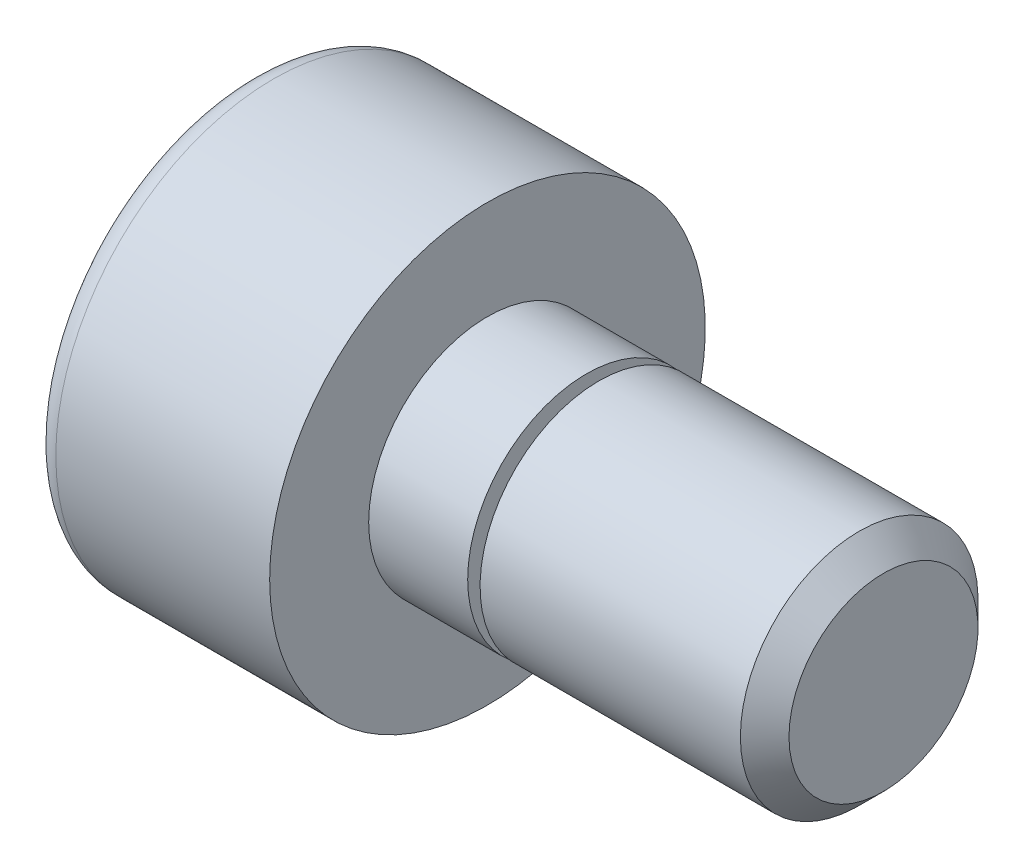
ISO-10303-21;
HEADER;
FILE_DESCRIPTION(('STEP AP214'),'2;1');
FILE_NAME('part.step','',(''),(''),'','','');
FILE_SCHEMA(('AUTOMOTIVE_DESIGN { 1 0 10303 214 1 1 1 1 }'));
ENDSEC;
DATA;
#1=APPLICATION_CONTEXT('core data for automotive mechanical design processes');
#2=APPLICATION_PROTOCOL_DEFINITION('international standard','automotive_design',2000,#1);
#3=PRODUCT_CONTEXT('',#1,'mechanical');
#4=PRODUCT('Part','Part','',(#3));
#5=PRODUCT_RELATED_PRODUCT_CATEGORY('part','',(#4));
#6=PRODUCT_DEFINITION_FORMATION('','',#4);
#7=PRODUCT_DEFINITION_CONTEXT('part definition',#1,'design');
#8=PRODUCT_DEFINITION('design','',#6,#7);
#9=PRODUCT_DEFINITION_SHAPE('','',#8);
#10=(LENGTH_UNIT() NAMED_UNIT(*) SI_UNIT(.MILLI.,.METRE.));
#11=(NAMED_UNIT(*) PLANE_ANGLE_UNIT() SI_UNIT($,.RADIAN.));
#12=(NAMED_UNIT(*) SI_UNIT($,.STERADIAN.) SOLID_ANGLE_UNIT());
#13=UNCERTAINTY_MEASURE_WITH_UNIT(LENGTH_MEASURE(1.E-05),#10,'distance_accuracy_value','');
#14=(GEOMETRIC_REPRESENTATION_CONTEXT(3) GLOBAL_UNCERTAINTY_ASSIGNED_CONTEXT((#13)) GLOBAL_UNIT_ASSIGNED_CONTEXT((#10,
#11,#12)) REPRESENTATION_CONTEXT('',''));
#15=CARTESIAN_POINT('',(0.,0.,0.));
#16=DIRECTION('',(0.,0.,1.));
#17=DIRECTION('',(1.,0.,0.));
#18=AXIS2_PLACEMENT_3D('',#15,#16,#17);
#19=CARTESIAN_POINT('',(4.99999999999999,0.596637499999982,0.));
#20=DIRECTION('',(1.,0.,0.));
#21=DIRECTION('',(0.,0.,-1.));
#22=AXIS2_PLACEMENT_3D('',#19,#20,#21);
#23=PLANE('',#22);
#24=CARTESIAN_POINT('',(5.00000000016598,0.,0.));
#25=DIRECTION('',(-1.,0.,0.));
#26=DIRECTION('',(0.,0.,1.));
#27=AXIS2_PLACEMENT_3D('',#24,#25,#26);
#28=CIRCLE('',#27,1.19327500010516);
#29=CARTESIAN_POINT('',(5.00000000016598,0.,1.19327500010516));
#30=VERTEX_POINT('',#29);
#31=EDGE_CURVE('E21',#30,#30,#28,.T.);
#32=ORIENTED_EDGE('',*,*,#31,.F.);
#33=EDGE_LOOP('',(#32));
#34=FACE_BOUND('',#33,.T.);
#35=ADVANCED_FACE('F17',(#34),#23,.T.);
#36=CARTESIAN_POINT('',(-1.70500129758011,0.,0.));
#37=DIRECTION('',(-1.,0.,0.));
#38=DIRECTION('',(0.,0.,1.));
#39=AXIS2_PLACEMENT_3D('',#36,#37,#38);
#40=CONICAL_SURFACE('',#39,1.45241249947506,1.04719754996206);
#41=CARTESIAN_POINT('',(-1.70000000094277,1.25000000021478,0.72243619933285));
#42=CARTESIAN_POINT('',(-1.68286546728477,1.25000000007714,0.663132482672235));
#43=CARTESIAN_POINT('',(-1.66717718499298,1.25000000002068,0.60335915904882));
#44=CARTESIAN_POINT('',(-1.63944863544149,1.24999999997928,0.48283994569199));
#45=CARTESIAN_POINT('',(-1.62741655949806,1.24999999999451,0.422092188519454));
#46=CARTESIAN_POINT('',(-1.60806725664683,1.25000000000537,0.301279508814381));
#47=CARTESIAN_POINT('',(-1.60064670562814,1.25000000000144,0.241231655699456));
#48=CARTESIAN_POINT('',(-1.59068492800529,1.24999999999857,0.120788901606474));
#49=CARTESIAN_POINT('',(-1.58813838618776,1.24999999999962,0.0603944508005647));
#50=CARTESIAN_POINT('',(-1.5881383861876,1.25000000000039,-0.0603944508133266));
#51=CARTESIAN_POINT('',(-1.59068492800512,1.25000000000011,-0.120788901621308));
#52=CARTESIAN_POINT('',(-1.60064670563102,1.2499999999999,-0.241231655717374));
#53=CARTESIAN_POINT('',(-1.60806725665276,1.24999999999997,-0.301279508833313));
#54=CARTESIAN_POINT('',(-1.62741655949895,1.25000000000003,-0.422092188543554));
#55=CARTESIAN_POINT('',(-1.63944863543404,1.25000000000002,-0.482839945720312));
#56=CARTESIAN_POINT('',(-1.66717718501289,1.24999999999999,-0.603359159074811));
#57=CARTESIAN_POINT('',(-1.68286546734031,1.24999999999997,-0.663132482691691));
#58=CARTESIAN_POINT('',(-1.70000000108341,1.25,-0.722436199332856));
#59=B_SPLINE_CURVE_WITH_KNOTS('',3,(#41,#42,#43,#44,#45,#46,#47,#48,#49,#50,#51,#52,#53,#54,#55,
#56,#57,#58),.UNSPECIFIED.,.F.,.F.,(4,2,2,2,2,2,2,2,4),(0.,0.185245445220431,0.370902902910376,
0.552234531911014,0.733368301892384,0.914502071879368,1.09583370088516,1.28149115858095,
1.46673660380932),.UNSPECIFIED.);
#60=CARTESIAN_POINT('',(-1.70000000111742,1.24999999986595,0.722436199682553));
#61=VERTEX_POINT('',#60);
#62=CARTESIAN_POINT('',(-1.70000000107267,1.24999999986595,-0.722436199527635));
#63=VERTEX_POINT('',#62);
#64=EDGE_CURVE('E89',#61,#63,#59,.T.);
#65=ORIENTED_EDGE('',*,*,#64,.T.);
#66=CARTESIAN_POINT('',(-1.700000000943,1.24999999987166,-0.722436199927195));
#67=CARTESIAN_POINT('',(-1.6816864655273,1.19504705421582,-0.754146854227431));
#68=CARTESIAN_POINT('',(-1.66503261857527,1.13961974362593,-0.78613124140006));
#69=CARTESIAN_POINT('',(-1.63596693871197,1.02780588171514,-0.850653546689622));
#70=CARTESIAN_POINT('',(-1.62356538163229,0.971417347626694,-0.883192608964836));
#71=CARTESIAN_POINT('',(-1.60426571868782,0.859338910256709,-0.947867587858669));
#72=CARTESIAN_POINT('',(-1.59723907577038,0.803666224581152,-0.979993569040396));
#73=CARTESIAN_POINT('',(-1.58885965389637,0.692059674420903,-1.04439624491314));
#74=CARTESIAN_POINT('',(-1.5874999265965,0.636126214014896,-1.07667270643012));
#75=CARTESIAN_POINT('',(-1.59036989313561,0.531663263643826,-1.13695316061698));
#76=CARTESIAN_POINT('',(-1.59389492551738,0.483117920552456,-1.16496630135008));
#77=CARTESIAN_POINT('',(-1.6050543982455,0.386343418562456,-1.22081012839927));
#78=CARTESIAN_POINT('',(-1.61269262928899,0.338114592929905,-1.24864062240381));
#79=CARTESIAN_POINT('',(-1.63178257578252,0.241141503285944,-1.30459904466556));
#80=CARTESIAN_POINT('',(-1.64331499479382,0.192409476238432,-1.33271991157001));
#81=CARTESIAN_POINT('',(-1.66948711578779,0.0956711177374292,-1.38854288198143));
#82=CARTESIAN_POINT('',(-1.68412069146549,0.0476635525329205,-1.41624569742571));
#83=CARTESIAN_POINT('',(-1.70000000108261,2.38524423776675E-10,-1.44374999986237));
#84=B_SPLINE_CURVE_WITH_KNOTS('',3,(#66,#67,#68,#69,#70,#71,#72,#73,#74,#75,#76,#77,#78,#79,#80,
#81,#82,#83),.UNSPECIFIED.,.F.,.F.,(4,2,2,2,2,2,2,2,4),(0.,0.198186454369542,0.396848513662745,
0.590596800568341,0.784107457962589,0.952424174462504,1.12089627669237,1.29309918128375,
1.46496502007198),.UNSPECIFIED.);
#85=CARTESIAN_POINT('',(-1.70000000107275,0.,-1.44374999984529));
#86=VERTEX_POINT('',#85);
#87=EDGE_CURVE('E117',#63,#86,#84,.T.);
#88=ORIENTED_EDGE('',*,*,#87,.T.);
#89=CARTESIAN_POINT('',(-1.70000000094296,-3.43022918294522E-10,-1.44375000005));
#90=CARTESIAN_POINT('',(-1.68168646552727,-0.0549529458612903,-1.41203934551137));
#91=CARTESIAN_POINT('',(-1.66503261857524,-0.11038025639475,-1.38005495824094));
#92=CARTESIAN_POINT('',(-1.63596693871195,-0.222194118264154,-1.31553265287968));
#93=CARTESIAN_POINT('',(-1.62356538163226,-0.278582652367828,-1.28299359063086));
#94=CARTESIAN_POINT('',(-1.6042657186878,-0.390661089748638,-1.2183186117558));
#95=CARTESIAN_POINT('',(-1.59723907577036,-0.446333775420271,-1.18619263056727));
#96=CARTESIAN_POINT('',(-1.58885965389634,-0.557940325577665,-1.1217899546896));
#97=CARTESIAN_POINT('',(-1.58749992659647,-0.613873785984737,-1.08951349317446));
#98=CARTESIAN_POINT('',(-1.59036989313559,-0.718336736356475,-1.02923303898876));
#99=CARTESIAN_POINT('',(-1.59389492551736,-0.766882079447621,-1.00121989825526));
#100=CARTESIAN_POINT('',(-1.60505439824547,-0.86365658143746,-0.945376071205784));
#101=CARTESIAN_POINT('',(-1.61269262928897,-0.911885407070074,-0.917545577201342));
#102=CARTESIAN_POINT('',(-1.6317825757825,-1.00885849671409,-0.861587154939678));
#103=CARTESIAN_POINT('',(-1.6433149947938,-1.05759052376159,-0.833466288035202));
#104=CARTESIAN_POINT('',(-1.66948711578777,-1.15432888226258,-0.777643317623734));
#105=CARTESIAN_POINT('',(-1.68412069146548,-1.20233644746708,-0.749940502179433));
#106=CARTESIAN_POINT('',(-1.7000000010826,-1.2499999997615,-0.722436199742815));
#107=B_SPLINE_CURVE_WITH_KNOTS('',3,(#89,#90,#91,#92,#93,#94,#95,#96,#97,#98,#99,#100,#101,#102,
#103,#104,#105,#106),.UNSPECIFIED.,.F.,.F.,(4,2,2,2,2,2,2,2,4),(0.,0.198186454369533,
0.396848513662727,0.590596800568313,0.784107457962553,0.952424174462478,1.12089627669236,
1.29309918128375,1.46496502007199),.UNSPECIFIED.);
#108=CARTESIAN_POINT('',(-1.70000000107264,-1.24999999986598,-0.722436199527589));
#109=VERTEX_POINT('',#108);
#110=EDGE_CURVE('E147',#86,#109,#107,.T.);
#111=ORIENTED_EDGE('',*,*,#110,.T.);
#112=CARTESIAN_POINT('',(-1.70000000094272,-1.2500000002148,-0.722436199332815));
#113=CARTESIAN_POINT('',(-1.68286546728472,-1.25000000007715,-0.663132482672202));
#114=CARTESIAN_POINT('',(-1.66717718499294,-1.25000000002068,-0.603359159048789));
#115=CARTESIAN_POINT('',(-1.63944863544145,-1.24999999997928,-0.482839945691965));
#116=CARTESIAN_POINT('',(-1.62741655949802,-1.24999999999451,-0.422092188519433));
#117=CARTESIAN_POINT('',(-1.6080672566468,-1.25000000000537,-0.301279508814366));
#118=CARTESIAN_POINT('',(-1.6006467056281,-1.25000000000144,-0.241231655699444));
#119=CARTESIAN_POINT('',(-1.59068492800526,-1.24999999999857,-0.120788901606469));
#120=CARTESIAN_POINT('',(-1.58813838618773,-1.24999999999962,-0.0603944508005625));
#121=CARTESIAN_POINT('',(-1.58813838618756,-1.25000000000039,0.0603944508133228));
#122=CARTESIAN_POINT('',(-1.59068492800508,-1.25000000000011,0.120788901621301));
#123=CARTESIAN_POINT('',(-1.60064670563099,-1.2499999999999,0.241231655717361));
#124=CARTESIAN_POINT('',(-1.60806725665273,-1.24999999999997,0.301279508833298));
#125=CARTESIAN_POINT('',(-1.62741655949892,-1.25000000000003,0.422092188543532));
#126=CARTESIAN_POINT('',(-1.63944863543401,-1.25000000000002,0.482839945720288));
#127=CARTESIAN_POINT('',(-1.66717718501285,-1.24999999999999,0.603359159074781));
#128=CARTESIAN_POINT('',(-1.68286546734028,-1.24999999999997,0.663132482691658));
#129=CARTESIAN_POINT('',(-1.70000000108337,-1.25,0.72243619933282));
#130=B_SPLINE_CURVE_WITH_KNOTS('',3,(#112,#113,#114,#115,#116,#117,#118,#119,#120,#121,#122,
#123,#124,#125,#126,#127,#128,#129),.UNSPECIFIED.,.F.,.F.,(4,2,2,2,2,2,2,2,4),(0.,
0.18524544522042,0.370902902910356,0.552234531910984,0.733368301892344,0.914502071879319,
1.0958337008851,1.28149115858089,1.46673660380924),.UNSPECIFIED.);
#131=CARTESIAN_POINT('',(-1.70000000107264,-1.24999999986597,0.722436199527603));
#132=VERTEX_POINT('',#131);
#133=EDGE_CURVE('E142',#109,#132,#130,.T.);
#134=ORIENTED_EDGE('',*,*,#133,.T.);
#135=CARTESIAN_POINT('',(-1.70000000094299,-1.24999999987169,0.722436199927152));
#136=CARTESIAN_POINT('',(-1.68168646552729,-1.19504705421587,0.754146854227398));
#137=CARTESIAN_POINT('',(-1.66503261857526,-1.13961974362597,0.786131241400031));
#138=CARTESIAN_POINT('',(-1.63596693871196,-1.02780588171519,0.850653546689596));
#139=CARTESIAN_POINT('',(-1.62356538163227,-0.971417347626742,0.883192608964809));
#140=CARTESIAN_POINT('',(-1.60426571868781,-0.859338910256757,0.947867587858641));
#141=CARTESIAN_POINT('',(-1.59723907577037,-0.803666224581201,0.979993569040368));
#142=CARTESIAN_POINT('',(-1.58885965389635,-0.692059674420952,1.04439624491311));
#143=CARTESIAN_POINT('',(-1.58749992659648,-0.636126214014945,1.07667270643009));
#144=CARTESIAN_POINT('',(-1.5903698931356,-0.531663263643873,1.13695316061695));
#145=CARTESIAN_POINT('',(-1.59389492551737,-0.483117920552502,1.16496630135006));
#146=CARTESIAN_POINT('',(-1.60505439824548,-0.386343418562498,1.22081012839924));
#147=CARTESIAN_POINT('',(-1.61269262928897,-0.338114592929946,1.24864062240379));
#148=CARTESIAN_POINT('',(-1.63178257578251,-0.241141503285981,1.30459904466554));
#149=CARTESIAN_POINT('',(-1.64331499479381,-0.192409476238467,1.33271991156999));
#150=CARTESIAN_POINT('',(-1.66948711578778,-0.0956711177374604,1.38854288198141));
#151=CARTESIAN_POINT('',(-1.68412069146548,-0.0476635525329499,1.41624569742569));
#152=CARTESIAN_POINT('',(-1.7000000010826,-2.38552283071818E-10,1.44374999986235));
#153=B_SPLINE_CURVE_WITH_KNOTS('',3,(#135,#136,#137,#138,#139,#140,#141,#142,#143,#144,#145,
#146,#147,#148,#149,#150,#151,#152),.UNSPECIFIED.,.F.,.F.,(4,2,2,2,2,2,2,2,4),(0.,
0.198186454369543,0.396848513662746,0.590596800568341,0.784107457962588,0.952424174462509,
1.12089627669239,1.29309918128377,1.46496502007201),.UNSPECIFIED.);
#154=CARTESIAN_POINT('',(-1.70000000107275,0.,1.44374999984529));
#155=VERTEX_POINT('',#154);
#156=EDGE_CURVE('E92',#132,#155,#153,.T.);
#157=ORIENTED_EDGE('',*,*,#156,.T.);
#158=CARTESIAN_POINT('',(-1.70000000094297,3.4299262673622E-10,1.44375000005));
#159=CARTESIAN_POINT('',(-1.68168646552728,0.054952945861264,1.41203934551138));
#160=CARTESIAN_POINT('',(-1.66503261857525,0.110380256394726,1.38005495824095));
#161=CARTESIAN_POINT('',(-1.63596693871196,0.222194118264133,1.31553265287969));
#162=CARTESIAN_POINT('',(-1.62356538163227,0.278582652367809,1.28299359063087));
#163=CARTESIAN_POINT('',(-1.60426571868781,0.390661089748621,1.21831861175581));
#164=CARTESIAN_POINT('',(-1.59723907577037,0.446333775420254,1.18619263056728));
#165=CARTESIAN_POINT('',(-1.58885965389636,0.557940325577651,1.1217899546896));
#166=CARTESIAN_POINT('',(-1.58749992659649,0.613873785984724,1.08951349317447));
#167=CARTESIAN_POINT('',(-1.5903698931356,0.718336736356459,1.02923303898877));
#168=CARTESIAN_POINT('',(-1.59389492551737,0.766882079447602,1.00121989825527));
#169=CARTESIAN_POINT('',(-1.60505439824549,0.863656581437433,0.9453760712058));
#170=CARTESIAN_POINT('',(-1.61269262928898,0.911885407070043,0.91754557720136));
#171=CARTESIAN_POINT('',(-1.63178257578252,1.00885849671405,0.8615871549397));
#172=CARTESIAN_POINT('',(-1.64331499479382,1.05759052376155,0.833466288035226));
#173=CARTESIAN_POINT('',(-1.66948711578779,1.15432888226253,0.777643317623762));
#174=CARTESIAN_POINT('',(-1.68412069146549,1.20233644746702,0.749940502179464));
#175=CARTESIAN_POINT('',(-1.70000000108261,1.24999999976144,0.722436199742848));
#176=B_SPLINE_CURVE_WITH_KNOTS('',3,(#158,#159,#160,#161,#162,#163,#164,#165,#166,#167,#168,
#169,#170,#171,#172,#173,#174,#175),.UNSPECIFIED.,.F.,.F.,(4,2,2,2,2,2,2,2,4),(0.,
0.198186454369537,0.396848513662734,0.590596800568325,0.784107457962568,0.952424174462481,
1.12089627669235,1.29309918128372,1.46496502007196),.UNSPECIFIED.);
#177=EDGE_CURVE('E62',#155,#61,#176,.T.);
#178=ORIENTED_EDGE('',*,*,#177,.T.);
#179=EDGE_LOOP('',(#65,#88,#111,#134,#157,#178));
#180=FACE_BOUND('',#179,.T.);
#181=CARTESIAN_POINT('',(-0.866450547675868,0.,0.));
#182=VERTEX_POINT('',#181);
#183=VERTEX_LOOP('',#182);
#184=FACE_BOUND('',#183,.T.);
#185=ADVANCED_FACE('F86',(#180,#184),#40,.F.);
#186=CARTESIAN_POINT('',(4.69327499990868,0.,0.));
#187=DIRECTION('',(-1.,0.,0.));
#188=DIRECTION('',(0.,0.,1.));
#189=AXIS2_PLACEMENT_3D('',#186,#187,#188);
#190=CONICAL_SURFACE('',#189,1.49999999979403,0.78539816247083);
#191=CARTESIAN_POINT('',(4.69327500000009,0.,0.));
#192=DIRECTION('',(-1.,0.,0.));
#193=DIRECTION('',(0.,1.,0.));
#194=AXIS2_PLACEMENT_3D('',#191,#192,#193);
#195=CIRCLE('',#194,1.49999999999999);
#196=CARTESIAN_POINT('',(4.69327500000009,1.49999999999997,0.));
#197=VERTEX_POINT('',#196);
#198=EDGE_CURVE('E104',#197,#197,#195,.T.);
#199=ORIENTED_EDGE('',*,*,#198,.F.);
#200=EDGE_LOOP('',(#199));
#201=FACE_BOUND('',#200,.T.);
#202=ORIENTED_EDGE('',*,*,#31,.T.);
#203=EDGE_LOOP('',(#202));
#204=FACE_BOUND('',#203,.T.);
#205=ADVANCED_FACE('F129',(#201,#204),#190,.T.);
#206=CARTESIAN_POINT('',(-2.99999999999999,0.,1.44374999999999));
#207=DIRECTION('',(0.,0.499805607369878,0.86613760733594));
#208=DIRECTION('',(0.,-0.86613760733594,0.499805607369878));
#209=AXIS2_PLACEMENT_3D('',#206,#207,#208);
#210=PLANE('',#209);
#211=DIRECTION('',(1.,0.,0.));
#212=VECTOR('',#211,1.);
#213=CARTESIAN_POINT('',(-2.99999999999999,0.,1.44375000000002));
#214=LINE('',#213,#212);
#215=CARTESIAN_POINT('',(-2.99999999999999,0.,1.44375));
#216=VERTEX_POINT('',#215);
#217=EDGE_CURVE('E94',#155,#216,#214,.F.);
#218=ORIENTED_EDGE('',*,*,#217,.T.);
#219=DIRECTION('',(0.,-0.866137607335945,0.499805607369869));
#220=VECTOR('',#219,1.);
#221=CARTESIAN_POINT('',(-2.99999999999999,1.25,0.722436199605204));
#222=LINE('',#221,#220);
#223=CARTESIAN_POINT('',(-2.99999999999999,1.25,0.722436199605204));
#224=VERTEX_POINT('',#223);
#225=EDGE_CURVE('E83',#224,#216,#222,.T.);
#226=ORIENTED_EDGE('',*,*,#225,.F.);
#227=DIRECTION('',(1.,0.,0.));
#228=VECTOR('',#227,1.);
#229=CARTESIAN_POINT('',(-2.99999999999999,1.25,0.722436199605204));
#230=LINE('',#229,#228);
#231=EDGE_CURVE('E95',#224,#61,#230,.T.);
#232=ORIENTED_EDGE('',*,*,#231,.T.);
#233=ORIENTED_EDGE('',*,*,#177,.F.);
#234=EDGE_LOOP('',(#218,#226,#232,#233));
#235=FACE_BOUND('',#234,.T.);
#236=ADVANCED_FACE('F96',(#235),#210,.F.);
#237=CARTESIAN_POINT('',(-2.99999999999999,-1.25,0.722436199605204));
#238=DIRECTION('',(0.,-0.499805607369878,0.86613760733594));
#239=DIRECTION('',(0.,-0.86613760733594,-0.499805607369878));
#240=AXIS2_PLACEMENT_3D('',#237,#238,#239);
#241=PLANE('',#240);
#242=DIRECTION('',(1.,0.,0.));
#243=VECTOR('',#242,1.);
#244=CARTESIAN_POINT('',(-2.99999999999999,-1.25,0.722436199605153));
#245=LINE('',#244,#243);
#246=CARTESIAN_POINT('',(-2.99999999999999,-1.25,0.722436199605172));
#247=VERTEX_POINT('',#246);
#248=EDGE_CURVE('E265',#132,#247,#245,.F.);
#249=ORIENTED_EDGE('',*,*,#248,.T.);
#250=DIRECTION('',(0.,-0.866137607335945,-0.499805607369869));
#251=VECTOR('',#250,1.);
#252=CARTESIAN_POINT('',(-2.99999999999999,0.,1.44374999999999));
#253=LINE('',#252,#251);
#254=EDGE_CURVE('E228',#216,#247,#253,.T.);
#255=ORIENTED_EDGE('',*,*,#254,.F.);
#256=ORIENTED_EDGE('',*,*,#217,.F.);
#257=ORIENTED_EDGE('',*,*,#156,.F.);
#258=EDGE_LOOP('',(#249,#255,#256,#257));
#259=FACE_BOUND('',#258,.T.);
#260=ADVANCED_FACE('F263',(#259),#241,.F.);
#261=CARTESIAN_POINT('',(-2.99999999999999,-1.25,-0.722436199605204));
#262=DIRECTION('',(0.,-1.,0.));
#263=DIRECTION('',(0.,0.,-1.));
#264=AXIS2_PLACEMENT_3D('',#261,#262,#263);
#265=PLANE('',#264);
#266=DIRECTION('',(1.,0.,0.));
#267=VECTOR('',#266,1.);
#268=CARTESIAN_POINT('',(-2.99999999999999,-1.25000000000008,-0.722436199605145));
#269=LINE('',#268,#267);
#270=CARTESIAN_POINT('',(-2.99999999999999,-1.25000000000005,-0.722436199605169));
#271=VERTEX_POINT('',#270);
#272=EDGE_CURVE('E154',#109,#271,#269,.F.);
#273=ORIENTED_EDGE('',*,*,#272,.T.);
#274=DIRECTION('',(0.,0.,1.));
#275=VECTOR('',#274,1.);
#276=CARTESIAN_POINT('',(-2.99999999999999,-1.25,0.));
#277=LINE('',#276,#275);
#278=EDGE_CURVE('E242',#247,#271,#277,.F.);
#279=ORIENTED_EDGE('',*,*,#278,.F.);
#280=ORIENTED_EDGE('',*,*,#248,.F.);
#281=ORIENTED_EDGE('',*,*,#133,.F.);
#282=EDGE_LOOP('',(#273,#279,#280,#281));
#283=FACE_BOUND('',#282,.T.);
#284=ADVANCED_FACE('F159',(#283),#265,.F.);
#285=CARTESIAN_POINT('',(-2.99999999999999,0.,-1.44374999999999));
#286=DIRECTION('',(0.,-0.499805607369878,-0.86613760733594));
#287=DIRECTION('',(0.,0.86613760733594,-0.499805607369878));
#288=AXIS2_PLACEMENT_3D('',#285,#286,#287);
#289=PLANE('',#288);
#290=DIRECTION('',(1.,0.,0.));
#291=VECTOR('',#290,1.);
#292=CARTESIAN_POINT('',(-2.99999999999999,0.,-1.44375000000003));
#293=LINE('',#292,#291);
#294=CARTESIAN_POINT('',(-2.99999999999999,0.,-1.44375000000002));
#295=VERTEX_POINT('',#294);
#296=EDGE_CURVE('E153',#86,#295,#293,.F.);
#297=ORIENTED_EDGE('',*,*,#296,.T.);
#298=DIRECTION('',(0.,0.866137607335945,-0.499805607369869));
#299=VECTOR('',#298,1.);
#300=CARTESIAN_POINT('',(-2.99999999999999,-1.25,-0.722436199605204));
#301=LINE('',#300,#299);
#302=EDGE_CURVE('E237',#271,#295,#301,.T.);
#303=ORIENTED_EDGE('',*,*,#302,.F.);
#304=ORIENTED_EDGE('',*,*,#272,.F.);
#305=ORIENTED_EDGE('',*,*,#110,.F.);
#306=EDGE_LOOP('',(#297,#303,#304,#305));
#307=FACE_BOUND('',#306,.T.);
#308=ADVANCED_FACE('F155',(#307),#289,.F.);
#309=CARTESIAN_POINT('',(-2.99999999999999,1.25,-0.722436199605204));
#310=DIRECTION('',(0.,0.499805607369878,-0.86613760733594));
#311=DIRECTION('',(0.,0.86613760733594,0.499805607369878));
#312=AXIS2_PLACEMENT_3D('',#309,#310,#311);
#313=PLANE('',#312);
#314=DIRECTION('',(1.,0.,0.));
#315=VECTOR('',#314,1.);
#316=CARTESIAN_POINT('',(-2.99999999999999,1.25,-0.722436199605204));
#317=LINE('',#316,#315);
#318=CARTESIAN_POINT('',(-2.99999999999999,1.25,-0.722436199605204));
#319=VERTEX_POINT('',#318);
#320=EDGE_CURVE('E100',#63,#319,#317,.F.);
#321=ORIENTED_EDGE('',*,*,#320,.T.);
#322=DIRECTION('',(0.,0.866137607335945,0.499805607369869));
#323=VECTOR('',#322,1.);
#324=CARTESIAN_POINT('',(-2.99999999999999,0.,-1.44374999999999));
#325=LINE('',#324,#323);
#326=EDGE_CURVE('E232',#295,#319,#325,.T.);
#327=ORIENTED_EDGE('',*,*,#326,.F.);
#328=ORIENTED_EDGE('',*,*,#296,.F.);
#329=ORIENTED_EDGE('',*,*,#87,.F.);
#330=EDGE_LOOP('',(#321,#327,#328,#329));
#331=FACE_BOUND('',#330,.T.);
#332=ADVANCED_FACE('F158',(#331),#313,.F.);
#333=CARTESIAN_POINT('',(-2.99999999999999,1.25,0.722436199605204));
#334=DIRECTION('',(0.,1.,0.));
#335=DIRECTION('',(0.,0.,1.));
#336=AXIS2_PLACEMENT_3D('',#333,#334,#335);
#337=PLANE('',#336);
#338=ORIENTED_EDGE('',*,*,#231,.F.);
#339=DIRECTION('',(0.,0.,1.));
#340=VECTOR('',#339,1.);
#341=CARTESIAN_POINT('',(-2.99999999999999,1.25,0.));
#342=LINE('',#341,#340);
#343=EDGE_CURVE('E225',#319,#224,#342,.T.);
#344=ORIENTED_EDGE('',*,*,#343,.F.);
#345=ORIENTED_EDGE('',*,*,#320,.F.);
#346=ORIENTED_EDGE('',*,*,#64,.F.);
#347=EDGE_LOOP('',(#338,#344,#345,#346));
#348=FACE_BOUND('',#347,.T.);
#349=ADVANCED_FACE('F103',(#348),#337,.F.);
#350=CARTESIAN_POINT('',(4.69327500000009,0.,0.));
#351=DIRECTION('',(-1.,0.,0.));
#352=DIRECTION('',(0.,0.,1.));
#353=AXIS2_PLACEMENT_3D('',#350,#351,#352);
#354=CYLINDRICAL_SURFACE('',#353,1.49999999999999);
#355=CARTESIAN_POINT('',(1.40630773523753,0.,0.));
#356=DIRECTION('',(1.,0.,0.));
#357=DIRECTION('',(0.,1.,0.));
#358=AXIS2_PLACEMENT_3D('',#355,#356,#357);
#359=CIRCLE('',#358,1.49999999990769);
#360=CARTESIAN_POINT('',(1.40630773523753,1.49999999990769,0.));
#361=VERTEX_POINT('',#360);
#362=EDGE_CURVE('E214',#361,#361,#359,.F.);
#363=ORIENTED_EDGE('',*,*,#362,.F.);
#364=EDGE_LOOP('',(#363));
#365=FACE_BOUND('',#364,.T.);
#366=ORIENTED_EDGE('',*,*,#198,.T.);
#367=EDGE_LOOP('',(#366));
#368=FACE_BOUND('',#367,.T.);
#369=ADVANCED_FACE('F169',(#365,#368),#354,.T.);
#370=CARTESIAN_POINT('',(-2.99999999999999,2.09687499999998,0.));
#371=DIRECTION('',(-1.,0.,0.));
#372=DIRECTION('',(0.,0.,1.));
#373=AXIS2_PLACEMENT_3D('',#370,#371,#372);
#374=PLANE('',#373);
#375=ORIENTED_EDGE('',*,*,#326,.T.);
#376=ORIENTED_EDGE('',*,*,#343,.T.);
#377=ORIENTED_EDGE('',*,*,#225,.T.);
#378=ORIENTED_EDGE('',*,*,#254,.T.);
#379=ORIENTED_EDGE('',*,*,#278,.T.);
#380=ORIENTED_EDGE('',*,*,#302,.T.);
#381=EDGE_LOOP('',(#375,#376,#377,#378,#379,#380));
#382=FACE_BOUND('',#381,.T.);
#383=CARTESIAN_POINT('',(-2.99999999999999,0.,-2.44999999999998));
#384=CARTESIAN_POINT('',(-2.99999999999999,-0.467309748428942,-2.44989883647268));
#385=CARTESIAN_POINT('',(-2.99999999999999,-0.90183203842658,-2.27798133760294));
#386=CARTESIAN_POINT('',(-2.99999999999999,-1.37316590275585,-2.09149944483619));
#387=CARTESIAN_POINT('',(-2.99999999999999,-1.73241161390703,-1.73241161390703));
#388=CARTESIAN_POINT('',(-2.99999999999999,-2.09091197099622,-1.37406880947389));
#389=CARTESIAN_POINT('',(-2.99999999999999,-2.27798133760293,-0.901832038426582));
#390=CARTESIAN_POINT('',(-2.99999999999999,-2.44989872063515,-0.467844842539404));
#391=CARTESIAN_POINT('',(-2.99999999999999,-2.44999999999998,0.));
#392=CARTESIAN_POINT('',(-2.99999999999999,-2.45010105288337,0.466798645496681));
#393=CARTESIAN_POINT('',(-2.99999999999999,-2.27798133760294,0.901832038426581));
#394=CARTESIAN_POINT('',(-2.99999999999999,-2.09149944483591,1.37316590275613));
#395=CARTESIAN_POINT('',(-2.99999999999999,-1.73241161390703,1.73241161390703));
#396=CARTESIAN_POINT('',(-2.99999999999999,-1.37406880947389,2.09091197099622));
#397=CARTESIAN_POINT('',(-2.99999999999999,-0.901832038426582,2.27798133760293));
#398=CARTESIAN_POINT('',(-2.99999999999999,-0.467844842539406,2.44989872063515));
#399=CARTESIAN_POINT('',(-2.99999999999999,0.,2.44999999999998));
#400=B_SPLINE_CURVE_WITH_KNOTS('',2,(#383,#384,#385,#386,#387,#388,#389,#390,#391,#392,#393,
#394,#395,#396,#397,#398,#399),.UNSPECIFIED.,.F.,.F.,(3,2,2,2,2,2,2,2,3),(0.,0.125,0.25,0.375,
0.5,0.625,0.75,0.875,1.),.UNSPECIFIED.);
#401=CARTESIAN_POINT('',(-2.99999999999999,0.,-2.44999999999998));
#402=VERTEX_POINT('',#401);
#403=CARTESIAN_POINT('',(-2.99999999999999,0.,2.44999999999998));
#404=VERTEX_POINT('',#403);
#405=EDGE_CURVE('E36',#402,#404,#400,.T.);
#406=ORIENTED_EDGE('',*,*,#405,.T.);
#407=CARTESIAN_POINT('',(-2.99999999999999,0.,2.44999999999998));
#408=CARTESIAN_POINT('',(-2.99999999999999,0.467309748428887,2.44989883647287));
#409=CARTESIAN_POINT('',(-2.99999999999999,0.90183203842658,2.27798133760294));
#410=CARTESIAN_POINT('',(-2.99999999999999,1.37316590275599,2.09149944483595));
#411=CARTESIAN_POINT('',(-2.99999999999999,1.73241161390703,1.73241161390703));
#412=CARTESIAN_POINT('',(-2.99999999999999,2.09091197099582,1.3740688094744));
#413=CARTESIAN_POINT('',(-2.99999999999999,2.27798133760294,0.901832038426581));
#414=CARTESIAN_POINT('',(-2.99999999999999,2.44989872063534,0.467844842539397));
#415=CARTESIAN_POINT('',(-2.99999999999999,2.44999999999998,0.));
#416=B_SPLINE_CURVE_WITH_KNOTS('',2,(#407,#408,#409,#410,#411,#412,#413,#414,#415),
.UNSPECIFIED.,.F.,.F.,(3,2,2,2,3),(0.,0.25,0.5,0.75,1.),.UNSPECIFIED.);
#417=CARTESIAN_POINT('',(-2.99999999999999,2.44999999999998,0.));
#418=VERTEX_POINT('',#417);
#419=EDGE_CURVE('E206',#404,#418,#416,.T.);
#420=ORIENTED_EDGE('',*,*,#419,.T.);
#421=CARTESIAN_POINT('',(-2.99999999999999,2.44999999999998,0.));
#422=CARTESIAN_POINT('',(-2.99999999999999,2.44989883647287,-0.467309748428838));
#423=CARTESIAN_POINT('',(-2.99999999999999,2.27798133760294,-0.901832038426581));
#424=CARTESIAN_POINT('',(-2.99999999999999,2.09149944483599,-1.37316590275595));
#425=CARTESIAN_POINT('',(-2.99999999999999,1.73241161390703,-1.73241161390703));
#426=CARTESIAN_POINT('',(-2.99999999999999,1.37406880947477,-2.09091197099545));
#427=CARTESIAN_POINT('',(-2.99999999999999,0.901832038426581,-2.27798133760294));
#428=CARTESIAN_POINT('',(-2.99999999999999,0.467844842540398,-2.44989872063515));
#429=CARTESIAN_POINT('',(-2.99999999999999,0.,-2.44999999999998));
#430=B_SPLINE_CURVE_WITH_KNOTS('',2,(#421,#422,#423,#424,#425,#426,#427,#428,#429),
.UNSPECIFIED.,.F.,.F.,(3,2,2,2,3),(0.,0.25,0.5,0.75,1.),.UNSPECIFIED.);
#431=EDGE_CURVE('E200',#418,#402,#430,.T.);
#432=ORIENTED_EDGE('',*,*,#431,.T.);
#433=EDGE_LOOP('',(#406,#420,#432));
#434=FACE_BOUND('',#433,.T.);
#435=ADVANCED_FACE('F192',(#382,#434),#374,.T.);
#436=CARTESIAN_POINT('',(1.40630773523753,0.,0.));
#437=DIRECTION('',(1.,0.,0.));
#438=DIRECTION('',(0.,0.,-1.));
#439=AXIS2_PLACEMENT_3D('',#436,#437,#438);
#440=CONICAL_SURFACE('',#439,1.49999999990769,1.0471975499748);
#441=CARTESIAN_POINT('',(1.24999999985675,0.,0.));
#442=DIRECTION('',(1.,0.,0.));
#443=DIRECTION('',(0.,0.,-1.));
#444=AXIS2_PLACEMENT_3D('',#441,#442,#443);
#445=CIRCLE('',#444,1.22926706137605);
#446=CARTESIAN_POINT('',(1.24999999985675,0.,-1.22926706137605));
#447=VERTEX_POINT('',#446);
#448=EDGE_CURVE('E115',#447,#447,#445,.T.);
#449=ORIENTED_EDGE('',*,*,#448,.T.);
#450=EDGE_LOOP('',(#449));
#451=FACE_BOUND('',#450,.T.);
#452=ORIENTED_EDGE('',*,*,#362,.T.);
#453=EDGE_LOOP('',(#452));
#454=FACE_BOUND('',#453,.T.);
#455=ADVANCED_FACE('F189',(#451,#454),#440,.T.);
#456=CARTESIAN_POINT('',(-2.69999999999999,0.,0.));
#457=DIRECTION('',(-1.,0.,0.));
#458=DIRECTION('',(0.,0.,1.));
#459=AXIS2_PLACEMENT_3D('',#456,#457,#458);
#460=TOROIDAL_SURFACE('',#459,2.44999999999998,0.300000000000006);
#461=CARTESIAN_POINT('',(-2.69999999999999,0.,0.));
#462=DIRECTION('',(-1.,0.,0.));
#463=DIRECTION('',(0.,1.,0.));
#464=AXIS2_PLACEMENT_3D('',#461,#462,#463);
#465=CIRCLE('',#464,2.75000000000002);
#466=CARTESIAN_POINT('',(-2.69999999999999,2.75,0.));
#467=VERTEX_POINT('',#466);
#468=EDGE_CURVE('E215',#467,#467,#465,.F.);
#469=ORIENTED_EDGE('',*,*,#468,.F.);
#470=EDGE_LOOP('',(#469));
#471=FACE_BOUND('',#470,.T.);
#472=ORIENTED_EDGE('',*,*,#419,.F.);
#473=ORIENTED_EDGE('',*,*,#405,.F.);
#474=ORIENTED_EDGE('',*,*,#431,.F.);
#475=EDGE_LOOP('',(#472,#473,#474));
#476=FACE_BOUND('',#475,.T.);
#477=ADVANCED_FACE('F19',(#471,#476),#460,.T.);
#478=CARTESIAN_POINT('',(1.25000000000005,1.3646335306587,0.));
#479=DIRECTION('',(-1.,0.,0.));
#480=DIRECTION('',(0.,0.,1.));
#481=AXIS2_PLACEMENT_3D('',#478,#479,#480);
#482=PLANE('',#481);
#483=ORIENTED_EDGE('',*,*,#448,.F.);
#484=EDGE_LOOP('',(#483));
#485=FACE_BOUND('',#484,.T.);
#486=CARTESIAN_POINT('',(1.25000000000005,0.,0.));
#487=DIRECTION('',(-1.,0.,0.));
#488=DIRECTION('',(0.,0.,1.));
#489=AXIS2_PLACEMENT_3D('',#486,#487,#488);
#490=CIRCLE('',#489,1.49999999999999);
#491=CARTESIAN_POINT('',(1.25000000000005,0.,1.49999999999999));
#492=VERTEX_POINT('',#491);
#493=EDGE_CURVE('E223',#492,#492,#490,.T.);
#494=ORIENTED_EDGE('',*,*,#493,.F.);
#495=EDGE_LOOP('',(#494));
#496=FACE_BOUND('',#495,.T.);
#497=ADVANCED_FACE('F184',(#485,#496),#482,.F.);
#498=CARTESIAN_POINT('',(0.,0.,0.));
#499=DIRECTION('',(-1.,0.,0.));
#500=DIRECTION('',(0.,0.,1.));
#501=AXIS2_PLACEMENT_3D('',#498,#499,#500);
#502=CYLINDRICAL_SURFACE('',#501,2.75000000000002);
#503=ORIENTED_EDGE('',*,*,#468,.T.);
#504=EDGE_LOOP('',(#503));
#505=FACE_BOUND('',#504,.T.);
#506=CARTESIAN_POINT('',(0.,0.,0.));
#507=DIRECTION('',(-1.,0.,0.));
#508=DIRECTION('',(0.,0.,1.));
#509=AXIS2_PLACEMENT_3D('',#506,#507,#508);
#510=CIRCLE('',#509,2.75000000000002);
#511=CARTESIAN_POINT('',(0.,0.,2.75000000000002));
#512=VERTEX_POINT('',#511);
#513=EDGE_CURVE('E27',#512,#512,#510,.F.);
#514=ORIENTED_EDGE('',*,*,#513,.F.);
#515=EDGE_LOOP('',(#514));
#516=FACE_BOUND('',#515,.T.);
#517=ADVANCED_FACE('F177',(#505,#516),#502,.T.);
#518=CARTESIAN_POINT('',(1.25000000000005,0.,0.));
#519=DIRECTION('',(-1.,0.,0.));
#520=DIRECTION('',(0.,0.,1.));
#521=AXIS2_PLACEMENT_3D('',#518,#519,#520);
#522=CYLINDRICAL_SURFACE('',#521,1.49999999999999);
#523=CARTESIAN_POINT('',(0.,0.,0.));
#524=DIRECTION('',(-1.,0.,0.));
#525=DIRECTION('',(0.,0.,1.));
#526=AXIS2_PLACEMENT_3D('',#523,#524,#525);
#527=CIRCLE('',#526,1.49999999999999);
#528=CARTESIAN_POINT('',(0.,0.,1.49999999999999));
#529=VERTEX_POINT('',#528);
#530=EDGE_CURVE('E11',#529,#529,#527,.T.);
#531=ORIENTED_EDGE('',*,*,#530,.F.);
#532=EDGE_LOOP('',(#531));
#533=FACE_BOUND('',#532,.T.);
#534=ORIENTED_EDGE('',*,*,#493,.T.);
#535=EDGE_LOOP('',(#534));
#536=FACE_BOUND('',#535,.T.);
#537=ADVANCED_FACE('F172',(#533,#536),#522,.T.);
#538=CARTESIAN_POINT('',(0.,2.12499999999998,0.));
#539=DIRECTION('',(1.,0.,0.));
#540=DIRECTION('',(0.,0.,-1.));
#541=AXIS2_PLACEMENT_3D('',#538,#539,#540);
#542=PLANE('',#541);
#543=ORIENTED_EDGE('',*,*,#530,.T.);
#544=EDGE_LOOP('',(#543));
#545=FACE_BOUND('',#544,.T.);
#546=ORIENTED_EDGE('',*,*,#513,.T.);
#547=EDGE_LOOP('',(#546));
#548=FACE_BOUND('',#547,.T.);
#549=ADVANCED_FACE('F170',(#545,#548),#542,.T.);
#550=CLOSED_SHELL('',(#35,#185,#205,#236,#260,#284,#308,#332,#349,#369,#435,#455,#477,#497,#517,
#537,#549));
#551=MANIFOLD_SOLID_BREP('B1',#550);
#552=ADVANCED_BREP_SHAPE_REPRESENTATION('',(#18,#551),#14);
#553=SHAPE_DEFINITION_REPRESENTATION(#9,#552);
ENDSEC;
END-ISO-10303-21;
